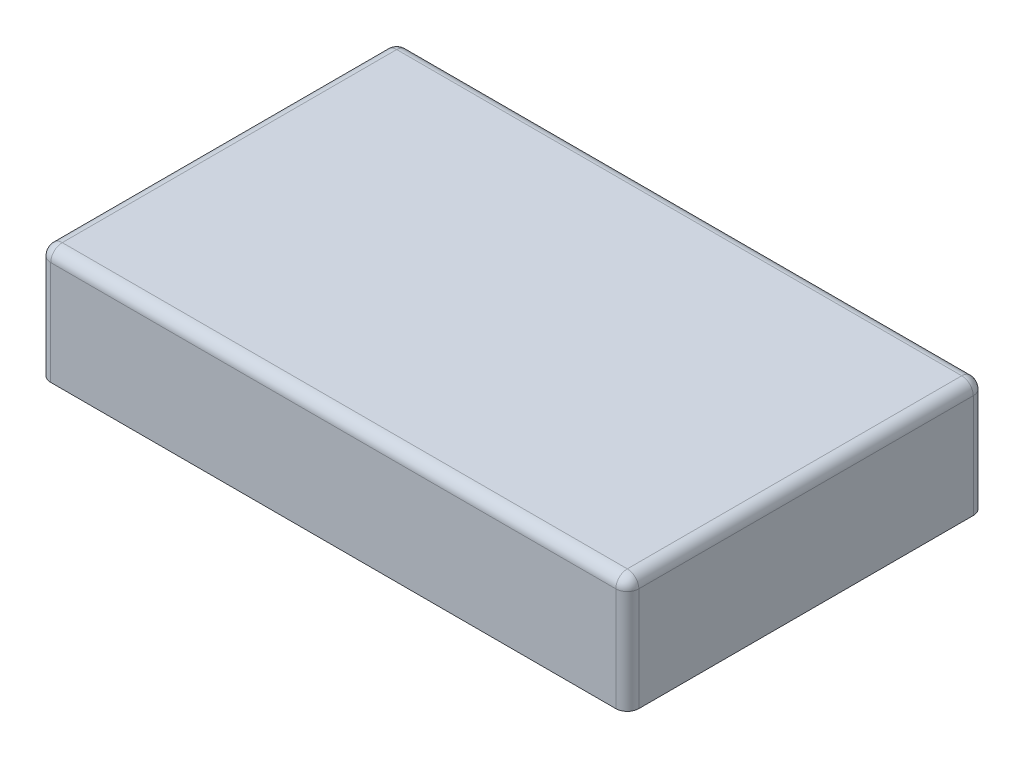
ISO-10303-21;
HEADER;
FILE_DESCRIPTION(('STEP AP214'),'2;1');
FILE_NAME('part.step','',(''),(''),'','','');
FILE_SCHEMA(('AUTOMOTIVE_DESIGN { 1 0 10303 214 1 1 1 1 }'));
ENDSEC;
DATA;
#1=APPLICATION_CONTEXT('core data for automotive mechanical design processes');
#2=APPLICATION_PROTOCOL_DEFINITION('international standard','automotive_design',2000,#1);
#3=PRODUCT_CONTEXT('',#1,'mechanical');
#4=PRODUCT('Part','Part','',(#3));
#5=PRODUCT_RELATED_PRODUCT_CATEGORY('part','',(#4));
#6=PRODUCT_DEFINITION_FORMATION('','',#4);
#7=PRODUCT_DEFINITION_CONTEXT('part definition',#1,'design');
#8=PRODUCT_DEFINITION('design','',#6,#7);
#9=PRODUCT_DEFINITION_SHAPE('','',#8);
#10=(LENGTH_UNIT() NAMED_UNIT(*) SI_UNIT(.MILLI.,.METRE.));
#11=(NAMED_UNIT(*) PLANE_ANGLE_UNIT() SI_UNIT($,.RADIAN.));
#12=(NAMED_UNIT(*) SI_UNIT($,.STERADIAN.) SOLID_ANGLE_UNIT());
#13=UNCERTAINTY_MEASURE_WITH_UNIT(LENGTH_MEASURE(1.E-05),#10,'distance_accuracy_value','');
#14=(GEOMETRIC_REPRESENTATION_CONTEXT(3) GLOBAL_UNCERTAINTY_ASSIGNED_CONTEXT((#13)) GLOBAL_UNIT_ASSIGNED_CONTEXT((#10,
#11,#12)) REPRESENTATION_CONTEXT('',''));
#15=CARTESIAN_POINT('',(0.,0.,0.));
#16=DIRECTION('',(0.,0.,1.));
#17=DIRECTION('',(1.,0.,0.));
#18=AXIS2_PLACEMENT_3D('',#15,#16,#17);
#19=CARTESIAN_POINT('',(49.,0.,29.));
#20=DIRECTION('',(0.,1.,0.));
#21=DIRECTION('',(0.,0.,1.));
#22=AXIS2_PLACEMENT_3D('',#19,#20,#21);
#23=PLANE('',#22);
#24=CARTESIAN_POINT('',(49.,0.,29.));
#25=DIRECTION('',(0.,1.,0.));
#26=DIRECTION('',(0.,0.,1.));
#27=AXIS2_PLACEMENT_3D('',#24,#25,#26);
#28=CIRCLE('',#27,2.);
#29=CARTESIAN_POINT('',(49.,0.,31.));
#30=VERTEX_POINT('',#29);
#31=CARTESIAN_POINT('',(51.,0.,29.));
#32=VERTEX_POINT('',#31);
#33=EDGE_CURVE('E211',#30,#32,#28,.T.);
#34=ORIENTED_EDGE('',*,*,#33,.F.);
#35=DIRECTION('',(1.,0.,0.));
#36=VECTOR('',#35,1.);
#37=CARTESIAN_POINT('',(-49.,0.,31.));
#38=LINE('',#37,#36);
#39=CARTESIAN_POINT('',(-49.,0.,31.));
#40=VERTEX_POINT('',#39);
#41=EDGE_CURVE('E239',#40,#30,#38,.T.);
#42=ORIENTED_EDGE('',*,*,#41,.F.);
#43=CARTESIAN_POINT('',(-49.,0.,29.));
#44=DIRECTION('',(0.,1.,0.));
#45=DIRECTION('',(0.,0.,-1.));
#46=AXIS2_PLACEMENT_3D('',#43,#44,#45);
#47=CIRCLE('',#46,2.);
#48=CARTESIAN_POINT('',(-51.,0.,29.));
#49=VERTEX_POINT('',#48);
#50=EDGE_CURVE('E236',#49,#40,#47,.T.);
#51=ORIENTED_EDGE('',*,*,#50,.F.);
#52=DIRECTION('',(0.,0.,1.));
#53=VECTOR('',#52,1.);
#54=CARTESIAN_POINT('',(-51.,0.,29.));
#55=LINE('',#54,#53);
#56=CARTESIAN_POINT('',(-51.,0.,-29.));
#57=VERTEX_POINT('',#56);
#58=EDGE_CURVE('E233',#57,#49,#55,.T.);
#59=ORIENTED_EDGE('',*,*,#58,.F.);
#60=CARTESIAN_POINT('',(-49.,0.,-29.));
#61=DIRECTION('',(0.,1.,0.));
#62=DIRECTION('',(0.,0.,-1.));
#63=AXIS2_PLACEMENT_3D('',#60,#61,#62);
#64=CIRCLE('',#63,2.);
#65=CARTESIAN_POINT('',(-49.,0.,-31.));
#66=VERTEX_POINT('',#65);
#67=EDGE_CURVE('E230',#66,#57,#64,.T.);
#68=ORIENTED_EDGE('',*,*,#67,.F.);
#69=DIRECTION('',(-1.,0.,0.));
#70=VECTOR('',#69,1.);
#71=CARTESIAN_POINT('',(-49.,0.,-31.));
#72=LINE('',#71,#70);
#73=CARTESIAN_POINT('',(49.,0.,-31.));
#74=VERTEX_POINT('',#73);
#75=EDGE_CURVE('E227',#74,#66,#72,.T.);
#76=ORIENTED_EDGE('',*,*,#75,.F.);
#77=CARTESIAN_POINT('',(49.,0.,-29.));
#78=DIRECTION('',(0.,1.,0.));
#79=DIRECTION('',(0.,0.,-1.));
#80=AXIS2_PLACEMENT_3D('',#77,#78,#79);
#81=CIRCLE('',#80,2.);
#82=CARTESIAN_POINT('',(51.,0.,-29.));
#83=VERTEX_POINT('',#82);
#84=EDGE_CURVE('E214',#83,#74,#81,.T.);
#85=ORIENTED_EDGE('',*,*,#84,.F.);
#86=DIRECTION('',(0.,0.,-1.));
#87=VECTOR('',#86,1.);
#88=CARTESIAN_POINT('',(51.,0.,29.));
#89=LINE('',#88,#87);
#90=EDGE_CURVE('E197',#32,#83,#89,.T.);
#91=ORIENTED_EDGE('',*,*,#90,.F.);
#92=EDGE_LOOP('',(#34,#42,#51,#59,#68,#76,#85,#91));
#93=FACE_BOUND('',#92,.T.);
#94=CARTESIAN_POINT('',(-48.,0.,-28.));
#95=DIRECTION('',(0.,1.,0.));
#96=DIRECTION('',(0.,0.,1.));
#97=AXIS2_PLACEMENT_3D('',#94,#95,#96);
#98=CIRCLE('',#97,2.);
#99=CARTESIAN_POINT('',(-50.,0.,-28.));
#100=VERTEX_POINT('',#99);
#101=CARTESIAN_POINT('',(-48.,0.,-30.));
#102=VERTEX_POINT('',#101);
#103=EDGE_CURVE('E313',#100,#102,#98,.F.);
#104=ORIENTED_EDGE('',*,*,#103,.F.);
#105=DIRECTION('',(0.,0.,1.));
#106=VECTOR('',#105,1.);
#107=CARTESIAN_POINT('',(-50.,0.,29.));
#108=LINE('',#107,#106);
#109=CARTESIAN_POINT('',(-50.,0.,28.));
#110=VERTEX_POINT('',#109);
#111=EDGE_CURVE('E311',#100,#110,#108,.T.);
#112=ORIENTED_EDGE('',*,*,#111,.T.);
#113=CARTESIAN_POINT('',(-48.,0.,28.));
#114=DIRECTION('',(0.,1.,0.));
#115=DIRECTION('',(0.,0.,1.));
#116=AXIS2_PLACEMENT_3D('',#113,#114,#115);
#117=CIRCLE('',#116,2.);
#118=CARTESIAN_POINT('',(-48.,0.,30.));
#119=VERTEX_POINT('',#118);
#120=EDGE_CURVE('E308',#119,#110,#117,.F.);
#121=ORIENTED_EDGE('',*,*,#120,.F.);
#122=DIRECTION('',(1.,0.,0.));
#123=VECTOR('',#122,1.);
#124=CARTESIAN_POINT('',(49.,0.,30.));
#125=LINE('',#124,#123);
#126=CARTESIAN_POINT('',(48.,0.,30.));
#127=VERTEX_POINT('',#126);
#128=EDGE_CURVE('E305',#119,#127,#125,.T.);
#129=ORIENTED_EDGE('',*,*,#128,.T.);
#130=CARTESIAN_POINT('',(48.,0.,28.));
#131=DIRECTION('',(0.,1.,0.));
#132=DIRECTION('',(0.,0.,1.));
#133=AXIS2_PLACEMENT_3D('',#130,#131,#132);
#134=CIRCLE('',#133,2.);
#135=CARTESIAN_POINT('',(50.,0.,28.));
#136=VERTEX_POINT('',#135);
#137=EDGE_CURVE('E302',#136,#127,#134,.F.);
#138=ORIENTED_EDGE('',*,*,#137,.F.);
#139=DIRECTION('',(0.,0.,-1.));
#140=VECTOR('',#139,1.);
#141=CARTESIAN_POINT('',(50.,0.,-29.));
#142=LINE('',#141,#140);
#143=CARTESIAN_POINT('',(50.,0.,-28.));
#144=VERTEX_POINT('',#143);
#145=EDGE_CURVE('E298',#136,#144,#142,.T.);
#146=ORIENTED_EDGE('',*,*,#145,.T.);
#147=CARTESIAN_POINT('',(48.,0.,-28.));
#148=DIRECTION('',(0.,1.,0.));
#149=DIRECTION('',(0.,0.,1.));
#150=AXIS2_PLACEMENT_3D('',#147,#148,#149);
#151=CIRCLE('',#150,2.);
#152=CARTESIAN_POINT('',(48.,0.,-30.));
#153=VERTEX_POINT('',#152);
#154=EDGE_CURVE('E277',#153,#144,#151,.F.);
#155=ORIENTED_EDGE('',*,*,#154,.F.);
#156=DIRECTION('',(-1.,0.,0.));
#157=VECTOR('',#156,1.);
#158=CARTESIAN_POINT('',(-49.,0.,-30.));
#159=LINE('',#158,#157);
#160=EDGE_CURVE('E300',#153,#102,#159,.T.);
#161=ORIENTED_EDGE('',*,*,#160,.T.);
#162=EDGE_LOOP('',(#104,#112,#121,#129,#138,#146,#155,#161));
#163=FACE_BOUND('',#162,.T.);
#164=ADVANCED_FACE('F33',(#93,#163),#23,.F.);
#165=CARTESIAN_POINT('',(49.,20.,29.));
#166=DIRECTION('',(0.,-1.,0.));
#167=DIRECTION('',(0.,0.,-1.));
#168=AXIS2_PLACEMENT_3D('',#165,#166,#167);
#169=CYLINDRICAL_SURFACE('',#168,2.);
#170=DIRECTION('',(0.,-1.,0.));
#171=VECTOR('',#170,1.);
#172=CARTESIAN_POINT('',(51.,20.,29.));
#173=LINE('',#172,#171);
#174=CARTESIAN_POINT('',(51.,18.,29.));
#175=VERTEX_POINT('',#174);
#176=EDGE_CURVE('E193',#175,#32,#173,.T.);
#177=ORIENTED_EDGE('',*,*,#176,.F.);
#178=CARTESIAN_POINT('',(49.,18.,29.));
#179=DIRECTION('',(0.,-1.,0.));
#180=DIRECTION('',(0.,0.,-1.));
#181=AXIS2_PLACEMENT_3D('',#178,#179,#180);
#182=CIRCLE('',#181,2.);
#183=CARTESIAN_POINT('',(49.,18.,31.));
#184=VERTEX_POINT('',#183);
#185=EDGE_CURVE('E275',#175,#184,#182,.T.);
#186=ORIENTED_EDGE('',*,*,#185,.T.);
#187=DIRECTION('',(0.,-1.,0.));
#188=VECTOR('',#187,1.);
#189=CARTESIAN_POINT('',(49.,20.,31.));
#190=LINE('',#189,#188);
#191=EDGE_CURVE('E218',#184,#30,#190,.T.);
#192=ORIENTED_EDGE('',*,*,#191,.T.);
#193=ORIENTED_EDGE('',*,*,#33,.T.);
#194=EDGE_LOOP('',(#177,#186,#192,#193));
#195=FACE_BOUND('',#194,.T.);
#196=ADVANCED_FACE('F216',(#195),#169,.T.);
#197=CARTESIAN_POINT('',(51.,20.,29.));
#198=DIRECTION('',(-1.,0.,0.));
#199=DIRECTION('',(0.,0.,1.));
#200=AXIS2_PLACEMENT_3D('',#197,#198,#199);
#201=PLANE('',#200);
#202=DIRECTION('',(0.,-1.,0.));
#203=VECTOR('',#202,1.);
#204=CARTESIAN_POINT('',(51.,20.,-29.));
#205=LINE('',#204,#203);
#206=CARTESIAN_POINT('',(51.,18.,-29.));
#207=VERTEX_POINT('',#206);
#208=EDGE_CURVE('E205',#207,#83,#205,.T.);
#209=ORIENTED_EDGE('',*,*,#208,.F.);
#210=DIRECTION('',(0.,0.,-1.));
#211=VECTOR('',#210,1.);
#212=CARTESIAN_POINT('',(51.,18.,29.));
#213=LINE('',#212,#211);
#214=EDGE_CURVE('E200',#207,#175,#213,.F.);
#215=ORIENTED_EDGE('',*,*,#214,.T.);
#216=ORIENTED_EDGE('',*,*,#176,.T.);
#217=ORIENTED_EDGE('',*,*,#90,.T.);
#218=EDGE_LOOP('',(#209,#215,#216,#217));
#219=FACE_BOUND('',#218,.T.);
#220=ADVANCED_FACE('F196',(#219),#201,.F.);
#221=CARTESIAN_POINT('',(49.,20.,-29.));
#222=DIRECTION('',(0.,-1.,0.));
#223=DIRECTION('',(0.,0.,-1.));
#224=AXIS2_PLACEMENT_3D('',#221,#222,#223);
#225=CYLINDRICAL_SURFACE('',#224,2.);
#226=DIRECTION('',(0.,-1.,0.));
#227=VECTOR('',#226,1.);
#228=CARTESIAN_POINT('',(49.,20.,-31.));
#229=LINE('',#228,#227);
#230=CARTESIAN_POINT('',(49.,18.,-31.));
#231=VERTEX_POINT('',#230);
#232=EDGE_CURVE('E250',#231,#74,#229,.T.);
#233=ORIENTED_EDGE('',*,*,#232,.F.);
#234=CARTESIAN_POINT('',(49.,18.,-29.));
#235=DIRECTION('',(0.,-1.,0.));
#236=DIRECTION('',(0.,0.,-1.));
#237=AXIS2_PLACEMENT_3D('',#234,#235,#236);
#238=CIRCLE('',#237,2.);
#239=EDGE_CURVE('E272',#231,#207,#238,.T.);
#240=ORIENTED_EDGE('',*,*,#239,.T.);
#241=ORIENTED_EDGE('',*,*,#208,.T.);
#242=ORIENTED_EDGE('',*,*,#84,.T.);
#243=EDGE_LOOP('',(#233,#240,#241,#242));
#244=FACE_BOUND('',#243,.T.);
#245=ADVANCED_FACE('F544',(#244),#225,.T.);
#246=CARTESIAN_POINT('',(-49.,20.,-31.));
#247=DIRECTION('',(0.,0.,1.));
#248=DIRECTION('',(1.,0.,0.));
#249=AXIS2_PLACEMENT_3D('',#246,#247,#248);
#250=PLANE('',#249);
#251=DIRECTION('',(0.,-1.,0.));
#252=VECTOR('',#251,1.);
#253=CARTESIAN_POINT('',(-49.,20.,-31.));
#254=LINE('',#253,#252);
#255=CARTESIAN_POINT('',(-49.,18.,-31.));
#256=VERTEX_POINT('',#255);
#257=EDGE_CURVE('E248',#256,#66,#254,.T.);
#258=ORIENTED_EDGE('',*,*,#257,.F.);
#259=DIRECTION('',(-1.,0.,0.));
#260=VECTOR('',#259,1.);
#261=CARTESIAN_POINT('',(49.,18.,-31.));
#262=LINE('',#261,#260);
#263=EDGE_CURVE('E270',#256,#231,#262,.F.);
#264=ORIENTED_EDGE('',*,*,#263,.T.);
#265=ORIENTED_EDGE('',*,*,#232,.T.);
#266=ORIENTED_EDGE('',*,*,#75,.T.);
#267=EDGE_LOOP('',(#258,#264,#265,#266));
#268=FACE_BOUND('',#267,.T.);
#269=ADVANCED_FACE('F540',(#268),#250,.F.);
#270=CARTESIAN_POINT('',(-49.,20.,-29.));
#271=DIRECTION('',(0.,-1.,0.));
#272=DIRECTION('',(0.,0.,-1.));
#273=AXIS2_PLACEMENT_3D('',#270,#271,#272);
#274=CYLINDRICAL_SURFACE('',#273,2.);
#275=DIRECTION('',(0.,-1.,0.));
#276=VECTOR('',#275,1.);
#277=CARTESIAN_POINT('',(-51.,20.,-29.));
#278=LINE('',#277,#276);
#279=CARTESIAN_POINT('',(-51.,18.,-29.));
#280=VERTEX_POINT('',#279);
#281=EDGE_CURVE('E246',#280,#57,#278,.T.);
#282=ORIENTED_EDGE('',*,*,#281,.F.);
#283=CARTESIAN_POINT('',(-49.,18.,-29.));
#284=DIRECTION('',(0.,-1.,0.));
#285=DIRECTION('',(0.,0.,-1.));
#286=AXIS2_PLACEMENT_3D('',#283,#284,#285);
#287=CIRCLE('',#286,2.);
#288=EDGE_CURVE('E268',#280,#256,#287,.T.);
#289=ORIENTED_EDGE('',*,*,#288,.T.);
#290=ORIENTED_EDGE('',*,*,#257,.T.);
#291=ORIENTED_EDGE('',*,*,#67,.T.);
#292=EDGE_LOOP('',(#282,#289,#290,#291));
#293=FACE_BOUND('',#292,.T.);
#294=ADVANCED_FACE('F536',(#293),#274,.T.);
#295=CARTESIAN_POINT('',(-51.,20.,29.));
#296=DIRECTION('',(1.,0.,0.));
#297=DIRECTION('',(0.,0.,-1.));
#298=AXIS2_PLACEMENT_3D('',#295,#296,#297);
#299=PLANE('',#298);
#300=DIRECTION('',(0.,-1.,0.));
#301=VECTOR('',#300,1.);
#302=CARTESIAN_POINT('',(-51.,20.,29.));
#303=LINE('',#302,#301);
#304=CARTESIAN_POINT('',(-51.,18.,29.));
#305=VERTEX_POINT('',#304);
#306=EDGE_CURVE('E244',#305,#49,#303,.T.);
#307=ORIENTED_EDGE('',*,*,#306,.F.);
#308=DIRECTION('',(0.,0.,1.));
#309=VECTOR('',#308,1.);
#310=CARTESIAN_POINT('',(-51.,18.,-29.));
#311=LINE('',#310,#309);
#312=EDGE_CURVE('E266',#305,#280,#311,.F.);
#313=ORIENTED_EDGE('',*,*,#312,.T.);
#314=ORIENTED_EDGE('',*,*,#281,.T.);
#315=ORIENTED_EDGE('',*,*,#58,.T.);
#316=EDGE_LOOP('',(#307,#313,#314,#315));
#317=FACE_BOUND('',#316,.T.);
#318=ADVANCED_FACE('F532',(#317),#299,.F.);
#319=CARTESIAN_POINT('',(-49.,20.,29.));
#320=DIRECTION('',(0.,-1.,0.));
#321=DIRECTION('',(0.,0.,-1.));
#322=AXIS2_PLACEMENT_3D('',#319,#320,#321);
#323=CYLINDRICAL_SURFACE('',#322,2.);
#324=DIRECTION('',(0.,-1.,0.));
#325=VECTOR('',#324,1.);
#326=CARTESIAN_POINT('',(-49.,20.,31.));
#327=LINE('',#326,#325);
#328=CARTESIAN_POINT('',(-49.,18.,31.));
#329=VERTEX_POINT('',#328);
#330=EDGE_CURVE('E242',#329,#40,#327,.T.);
#331=ORIENTED_EDGE('',*,*,#330,.F.);
#332=CARTESIAN_POINT('',(-49.,18.,29.));
#333=DIRECTION('',(0.,-1.,0.));
#334=DIRECTION('',(0.,0.,-1.));
#335=AXIS2_PLACEMENT_3D('',#332,#333,#334);
#336=CIRCLE('',#335,2.);
#337=EDGE_CURVE('E264',#329,#305,#336,.T.);
#338=ORIENTED_EDGE('',*,*,#337,.T.);
#339=ORIENTED_EDGE('',*,*,#306,.T.);
#340=ORIENTED_EDGE('',*,*,#50,.T.);
#341=EDGE_LOOP('',(#331,#338,#339,#340));
#342=FACE_BOUND('',#341,.T.);
#343=ADVANCED_FACE('F528',(#342),#323,.T.);
#344=CARTESIAN_POINT('',(-49.,20.,31.));
#345=DIRECTION('',(0.,0.,-1.));
#346=DIRECTION('',(-1.,0.,0.));
#347=AXIS2_PLACEMENT_3D('',#344,#345,#346);
#348=PLANE('',#347);
#349=ORIENTED_EDGE('',*,*,#191,.F.);
#350=DIRECTION('',(1.,0.,0.));
#351=VECTOR('',#350,1.);
#352=CARTESIAN_POINT('',(-49.,18.,31.));
#353=LINE('',#352,#351);
#354=EDGE_CURVE('E261',#184,#329,#353,.F.);
#355=ORIENTED_EDGE('',*,*,#354,.T.);
#356=ORIENTED_EDGE('',*,*,#330,.T.);
#357=ORIENTED_EDGE('',*,*,#41,.T.);
#358=EDGE_LOOP('',(#349,#355,#356,#357));
#359=FACE_BOUND('',#358,.T.);
#360=ADVANCED_FACE('F525',(#359),#348,.F.);
#361=CARTESIAN_POINT('',(49.,20.,29.));
#362=DIRECTION('',(0.,1.,0.));
#363=DIRECTION('',(0.,0.,1.));
#364=AXIS2_PLACEMENT_3D('',#361,#362,#363);
#365=PLANE('',#364);
#366=DIRECTION('',(0.,0.,1.));
#367=VECTOR('',#366,1.);
#368=CARTESIAN_POINT('',(-49.,20.,29.));
#369=LINE('',#368,#367);
#370=CARTESIAN_POINT('',(-49.,20.,-29.));
#371=VERTEX_POINT('',#370);
#372=CARTESIAN_POINT('',(-49.,20.,29.));
#373=VERTEX_POINT('',#372);
#374=EDGE_CURVE('E256',#371,#373,#369,.T.);
#375=ORIENTED_EDGE('',*,*,#374,.T.);
#376=DIRECTION('',(1.,0.,0.));
#377=VECTOR('',#376,1.);
#378=CARTESIAN_POINT('',(49.,20.,29.));
#379=LINE('',#378,#377);
#380=CARTESIAN_POINT('',(49.,20.,29.));
#381=VERTEX_POINT('',#380);
#382=EDGE_CURVE('E258',#373,#381,#379,.T.);
#383=ORIENTED_EDGE('',*,*,#382,.T.);
#384=DIRECTION('',(0.,0.,-1.));
#385=VECTOR('',#384,1.);
#386=CARTESIAN_POINT('',(49.,20.,-29.));
#387=LINE('',#386,#385);
#388=CARTESIAN_POINT('',(49.,20.,-29.));
#389=VERTEX_POINT('',#388);
#390=EDGE_CURVE('E204',#381,#389,#387,.T.);
#391=ORIENTED_EDGE('',*,*,#390,.T.);
#392=DIRECTION('',(-1.,0.,0.));
#393=VECTOR('',#392,1.);
#394=CARTESIAN_POINT('',(-49.,20.,-29.));
#395=LINE('',#394,#393);
#396=EDGE_CURVE('E254',#389,#371,#395,.T.);
#397=ORIENTED_EDGE('',*,*,#396,.T.);
#398=EDGE_LOOP('',(#375,#383,#391,#397));
#399=FACE_BOUND('',#398,.T.);
#400=ADVANCED_FACE('F524',(#399),#365,.T.);
#401=CARTESIAN_POINT('',(49.,18.,-29.));
#402=DIRECTION('',(1.,0.,0.));
#403=DIRECTION('',(0.,0.,-1.));
#404=AXIS2_PLACEMENT_3D('',#401,#402,#403);
#405=CYLINDRICAL_SURFACE('',#404,2.);
#406=CARTESIAN_POINT('',(49.,18.,-29.));
#407=DIRECTION('',(1.,0.,0.));
#408=DIRECTION('',(0.,0.,-1.));
#409=AXIS2_PLACEMENT_3D('',#406,#407,#408);
#410=CIRCLE('',#409,2.);
#411=EDGE_CURVE('E223',#231,#389,#410,.T.);
#412=ORIENTED_EDGE('',*,*,#411,.F.);
#413=ORIENTED_EDGE('',*,*,#263,.F.);
#414=CARTESIAN_POINT('',(-49.,18.,-29.));
#415=DIRECTION('',(-1.,0.,0.));
#416=DIRECTION('',(0.,0.,1.));
#417=AXIS2_PLACEMENT_3D('',#414,#415,#416);
#418=CIRCLE('',#417,2.);
#419=EDGE_CURVE('E220',#371,#256,#418,.T.);
#420=ORIENTED_EDGE('',*,*,#419,.F.);
#421=ORIENTED_EDGE('',*,*,#396,.F.);
#422=EDGE_LOOP('',(#412,#413,#420,#421));
#423=FACE_BOUND('',#422,.T.);
#424=ADVANCED_FACE('F579',(#423),#405,.T.);
#425=CARTESIAN_POINT('',(-49.,18.,-29.));
#426=DIRECTION('',(0.,1.,0.));
#427=DIRECTION('',(0.,0.,1.));
#428=AXIS2_PLACEMENT_3D('',#425,#426,#427);
#429=SPHERICAL_SURFACE('',#428,2.);
#430=ORIENTED_EDGE('',*,*,#419,.T.);
#431=ORIENTED_EDGE('',*,*,#288,.F.);
#432=CARTESIAN_POINT('',(-49.,18.,-29.));
#433=DIRECTION('',(0.,0.,1.));
#434=DIRECTION('',(1.,0.,0.));
#435=AXIS2_PLACEMENT_3D('',#432,#433,#434);
#436=CIRCLE('',#435,2.);
#437=EDGE_CURVE('E291',#371,#280,#436,.T.);
#438=ORIENTED_EDGE('',*,*,#437,.F.);
#439=EDGE_LOOP('',(#430,#431,#438));
#440=FACE_BOUND('',#439,.T.);
#441=ADVANCED_FACE('F575',(#440),#429,.T.);
#442=CARTESIAN_POINT('',(49.,18.,-29.));
#443=DIRECTION('',(0.,1.,0.));
#444=DIRECTION('',(0.,0.,1.));
#445=AXIS2_PLACEMENT_3D('',#442,#443,#444);
#446=SPHERICAL_SURFACE('',#445,2.);
#447=ORIENTED_EDGE('',*,*,#239,.F.);
#448=ORIENTED_EDGE('',*,*,#411,.T.);
#449=CARTESIAN_POINT('',(49.,18.,-29.));
#450=DIRECTION('',(0.,0.,1.));
#451=DIRECTION('',(1.,0.,0.));
#452=AXIS2_PLACEMENT_3D('',#449,#450,#451);
#453=CIRCLE('',#452,2.);
#454=EDGE_CURVE('E288',#207,#389,#453,.T.);
#455=ORIENTED_EDGE('',*,*,#454,.F.);
#456=EDGE_LOOP('',(#447,#448,#455));
#457=FACE_BOUND('',#456,.T.);
#458=ADVANCED_FACE('F571',(#457),#446,.T.);
#459=CARTESIAN_POINT('',(-49.,18.,29.));
#460=DIRECTION('',(0.,0.,-1.));
#461=DIRECTION('',(-1.,0.,0.));
#462=AXIS2_PLACEMENT_3D('',#459,#460,#461);
#463=CYLINDRICAL_SURFACE('',#462,2.);
#464=ORIENTED_EDGE('',*,*,#437,.T.);
#465=ORIENTED_EDGE('',*,*,#312,.F.);
#466=CARTESIAN_POINT('',(-49.,18.,29.));
#467=DIRECTION('',(0.,0.,1.));
#468=DIRECTION('',(1.,0.,0.));
#469=AXIS2_PLACEMENT_3D('',#466,#467,#468);
#470=CIRCLE('',#469,2.);
#471=EDGE_CURVE('E285',#373,#305,#470,.T.);
#472=ORIENTED_EDGE('',*,*,#471,.F.);
#473=ORIENTED_EDGE('',*,*,#374,.F.);
#474=EDGE_LOOP('',(#464,#465,#472,#473));
#475=FACE_BOUND('',#474,.T.);
#476=ADVANCED_FACE('F567',(#475),#463,.T.);
#477=CARTESIAN_POINT('',(49.,18.,29.));
#478=DIRECTION('',(0.,0.,1.));
#479=DIRECTION('',(1.,0.,0.));
#480=AXIS2_PLACEMENT_3D('',#477,#478,#479);
#481=CYLINDRICAL_SURFACE('',#480,2.);
#482=ORIENTED_EDGE('',*,*,#454,.T.);
#483=ORIENTED_EDGE('',*,*,#390,.F.);
#484=CARTESIAN_POINT('',(49.,18.,29.));
#485=DIRECTION('',(0.,0.,1.));
#486=DIRECTION('',(1.,0.,0.));
#487=AXIS2_PLACEMENT_3D('',#484,#485,#486);
#488=CIRCLE('',#487,2.);
#489=EDGE_CURVE('E282',#175,#381,#488,.T.);
#490=ORIENTED_EDGE('',*,*,#489,.F.);
#491=ORIENTED_EDGE('',*,*,#214,.F.);
#492=EDGE_LOOP('',(#482,#483,#490,#491));
#493=FACE_BOUND('',#492,.T.);
#494=ADVANCED_FACE('F563',(#493),#481,.T.);
#495=CARTESIAN_POINT('',(-49.,18.,29.));
#496=DIRECTION('',(0.,1.,0.));
#497=DIRECTION('',(0.,0.,1.));
#498=AXIS2_PLACEMENT_3D('',#495,#496,#497);
#499=SPHERICAL_SURFACE('',#498,2.);
#500=ORIENTED_EDGE('',*,*,#471,.T.);
#501=ORIENTED_EDGE('',*,*,#337,.F.);
#502=CARTESIAN_POINT('',(-49.,18.,29.));
#503=DIRECTION('',(1.,0.,0.));
#504=DIRECTION('',(0.,0.,-1.));
#505=AXIS2_PLACEMENT_3D('',#502,#503,#504);
#506=CIRCLE('',#505,2.);
#507=EDGE_CURVE('E280',#373,#329,#506,.T.);
#508=ORIENTED_EDGE('',*,*,#507,.F.);
#509=EDGE_LOOP('',(#500,#501,#508));
#510=FACE_BOUND('',#509,.T.);
#511=ADVANCED_FACE('F559',(#510),#499,.T.);
#512=CARTESIAN_POINT('',(49.,18.,29.));
#513=DIRECTION('',(0.,1.,0.));
#514=DIRECTION('',(0.,0.,1.));
#515=AXIS2_PLACEMENT_3D('',#512,#513,#514);
#516=SPHERICAL_SURFACE('',#515,2.);
#517=ORIENTED_EDGE('',*,*,#185,.F.);
#518=ORIENTED_EDGE('',*,*,#489,.T.);
#519=CARTESIAN_POINT('',(49.,18.,29.));
#520=DIRECTION('',(-1.,0.,0.));
#521=DIRECTION('',(0.,0.,1.));
#522=AXIS2_PLACEMENT_3D('',#519,#520,#521);
#523=CIRCLE('',#522,2.);
#524=EDGE_CURVE('E278',#184,#381,#523,.T.);
#525=ORIENTED_EDGE('',*,*,#524,.F.);
#526=EDGE_LOOP('',(#517,#518,#525));
#527=FACE_BOUND('',#526,.T.);
#528=ADVANCED_FACE('F555',(#527),#516,.T.);
#529=CARTESIAN_POINT('',(49.,18.,29.));
#530=DIRECTION('',(-1.,0.,0.));
#531=DIRECTION('',(0.,0.,1.));
#532=AXIS2_PLACEMENT_3D('',#529,#530,#531);
#533=CYLINDRICAL_SURFACE('',#532,2.);
#534=ORIENTED_EDGE('',*,*,#507,.T.);
#535=ORIENTED_EDGE('',*,*,#354,.F.);
#536=ORIENTED_EDGE('',*,*,#524,.T.);
#537=ORIENTED_EDGE('',*,*,#382,.F.);
#538=EDGE_LOOP('',(#534,#535,#536,#537));
#539=FACE_BOUND('',#538,.T.);
#540=ADVANCED_FACE('F551',(#539),#533,.T.);
#541=CARTESIAN_POINT('',(49.,20.,29.));
#542=DIRECTION('',(-1.,0.,0.));
#543=DIRECTION('',(0.,0.,1.));
#544=AXIS2_PLACEMENT_3D('',#541,#542,#543);
#545=PLANE('',#544);
#546=DIRECTION('',(0.,-1.,0.));
#547=VECTOR('',#546,1.);
#548=CARTESIAN_POINT('',(49.,18.,28.));
#549=LINE('',#548,#547);
#550=CARTESIAN_POINT('',(49.,1.,28.));
#551=VERTEX_POINT('',#550);
#552=CARTESIAN_POINT('',(49.,17.,28.));
#553=VERTEX_POINT('',#552);
#554=EDGE_CURVE('E42',#551,#553,#549,.F.);
#555=ORIENTED_EDGE('',*,*,#554,.T.);
#556=DIRECTION('',(0.,0.,-1.));
#557=VECTOR('',#556,1.);
#558=CARTESIAN_POINT('',(49.,17.,29.));
#559=LINE('',#558,#557);
#560=CARTESIAN_POINT('',(49.,17.,-28.));
#561=VERTEX_POINT('',#560);
#562=EDGE_CURVE('E11',#553,#561,#559,.T.);
#563=ORIENTED_EDGE('',*,*,#562,.T.);
#564=DIRECTION('',(0.,-1.,0.));
#565=VECTOR('',#564,1.);
#566=CARTESIAN_POINT('',(49.,0.,-28.));
#567=LINE('',#566,#565);
#568=CARTESIAN_POINT('',(49.,1.,-28.));
#569=VERTEX_POINT('',#568);
#570=EDGE_CURVE('E352',#561,#569,#567,.T.);
#571=ORIENTED_EDGE('',*,*,#570,.T.);
#572=DIRECTION('',(0.,0.,-1.));
#573=VECTOR('',#572,1.);
#574=CARTESIAN_POINT('',(49.,1.,29.));
#575=LINE('',#574,#573);
#576=EDGE_CURVE('E53',#569,#551,#575,.F.);
#577=ORIENTED_EDGE('',*,*,#576,.T.);
#578=EDGE_LOOP('',(#555,#563,#571,#577));
#579=FACE_BOUND('',#578,.T.);
#580=ADVANCED_FACE('F554',(#579),#545,.T.);
#581=CARTESIAN_POINT('',(-49.,20.,-29.));
#582=DIRECTION('',(0.,0.,1.));
#583=DIRECTION('',(1.,0.,0.));
#584=AXIS2_PLACEMENT_3D('',#581,#582,#583);
#585=PLANE('',#584);
#586=DIRECTION('',(1.,0.,0.));
#587=VECTOR('',#586,1.);
#588=CARTESIAN_POINT('',(-49.,17.,-29.));
#589=LINE('',#588,#587);
#590=CARTESIAN_POINT('',(48.,17.,-29.));
#591=VERTEX_POINT('',#590);
#592=CARTESIAN_POINT('',(-48.,17.,-29.));
#593=VERTEX_POINT('',#592);
#594=EDGE_CURVE('E327',#591,#593,#589,.F.);
#595=ORIENTED_EDGE('',*,*,#594,.T.);
#596=DIRECTION('',(0.,-1.,0.));
#597=VECTOR('',#596,1.);
#598=CARTESIAN_POINT('',(-48.,0.,-29.));
#599=LINE('',#598,#597);
#600=CARTESIAN_POINT('',(-48.,1.,-29.));
#601=VERTEX_POINT('',#600);
#602=EDGE_CURVE('E332',#593,#601,#599,.T.);
#603=ORIENTED_EDGE('',*,*,#602,.T.);
#604=DIRECTION('',(-1.,0.,0.));
#605=VECTOR('',#604,1.);
#606=CARTESIAN_POINT('',(49.,1.,-29.));
#607=LINE('',#606,#605);
#608=CARTESIAN_POINT('',(48.,1.,-29.));
#609=VERTEX_POINT('',#608);
#610=EDGE_CURVE('E329',#601,#609,#607,.F.);
#611=ORIENTED_EDGE('',*,*,#610,.T.);
#612=DIRECTION('',(0.,-1.,0.));
#613=VECTOR('',#612,1.);
#614=CARTESIAN_POINT('',(48.,18.,-29.));
#615=LINE('',#614,#613);
#616=EDGE_CURVE('E325',#609,#591,#615,.F.);
#617=ORIENTED_EDGE('',*,*,#616,.T.);
#618=EDGE_LOOP('',(#595,#603,#611,#617));
#619=FACE_BOUND('',#618,.T.);
#620=ADVANCED_FACE('F447',(#619),#585,.T.);
#621=CARTESIAN_POINT('',(-49.,20.,29.));
#622=DIRECTION('',(1.,0.,0.));
#623=DIRECTION('',(0.,0.,-1.));
#624=AXIS2_PLACEMENT_3D('',#621,#622,#623);
#625=PLANE('',#624);
#626=DIRECTION('',(0.,-1.,0.));
#627=VECTOR('',#626,1.);
#628=CARTESIAN_POINT('',(-49.,18.,-28.));
#629=LINE('',#628,#627);
#630=CARTESIAN_POINT('',(-49.,1.,-28.));
#631=VERTEX_POINT('',#630);
#632=CARTESIAN_POINT('',(-49.,17.,-28.));
#633=VERTEX_POINT('',#632);
#634=EDGE_CURVE('E347',#631,#633,#629,.F.);
#635=ORIENTED_EDGE('',*,*,#634,.T.);
#636=DIRECTION('',(0.,0.,-1.));
#637=VECTOR('',#636,1.);
#638=CARTESIAN_POINT('',(-49.,17.,29.));
#639=LINE('',#638,#637);
#640=CARTESIAN_POINT('',(-49.,17.,28.));
#641=VERTEX_POINT('',#640);
#642=EDGE_CURVE('E349',#633,#641,#639,.F.);
#643=ORIENTED_EDGE('',*,*,#642,.T.);
#644=DIRECTION('',(0.,-1.,0.));
#645=VECTOR('',#644,1.);
#646=CARTESIAN_POINT('',(-49.,0.,28.));
#647=LINE('',#646,#645);
#648=CARTESIAN_POINT('',(-49.,1.,28.));
#649=VERTEX_POINT('',#648);
#650=EDGE_CURVE('E343',#641,#649,#647,.T.);
#651=ORIENTED_EDGE('',*,*,#650,.T.);
#652=DIRECTION('',(0.,0.,1.));
#653=VECTOR('',#652,1.);
#654=CARTESIAN_POINT('',(-49.,1.,-29.));
#655=LINE('',#654,#653);
#656=EDGE_CURVE('E345',#649,#631,#655,.F.);
#657=ORIENTED_EDGE('',*,*,#656,.T.);
#658=EDGE_LOOP('',(#635,#643,#651,#657));
#659=FACE_BOUND('',#658,.T.);
#660=ADVANCED_FACE('F439',(#659),#625,.T.);
#661=CARTESIAN_POINT('',(-49.,20.,29.));
#662=DIRECTION('',(0.,0.,-1.));
#663=DIRECTION('',(-1.,0.,0.));
#664=AXIS2_PLACEMENT_3D('',#661,#662,#663);
#665=PLANE('',#664);
#666=DIRECTION('',(1.,0.,0.));
#667=VECTOR('',#666,1.);
#668=CARTESIAN_POINT('',(-49.,1.,29.));
#669=LINE('',#668,#667);
#670=CARTESIAN_POINT('',(48.,1.,29.));
#671=VERTEX_POINT('',#670);
#672=CARTESIAN_POINT('',(-48.,1.,29.));
#673=VERTEX_POINT('',#672);
#674=EDGE_CURVE('E320',#671,#673,#669,.F.);
#675=ORIENTED_EDGE('',*,*,#674,.T.);
#676=DIRECTION('',(0.,-1.,0.));
#677=VECTOR('',#676,1.);
#678=CARTESIAN_POINT('',(-48.,18.,29.));
#679=LINE('',#678,#677);
#680=CARTESIAN_POINT('',(-48.,17.,29.));
#681=VERTEX_POINT('',#680);
#682=EDGE_CURVE('E323',#673,#681,#679,.F.);
#683=ORIENTED_EDGE('',*,*,#682,.T.);
#684=DIRECTION('',(-1.,0.,0.));
#685=VECTOR('',#684,1.);
#686=CARTESIAN_POINT('',(-49.,17.,29.));
#687=LINE('',#686,#685);
#688=CARTESIAN_POINT('',(48.,17.,29.));
#689=VERTEX_POINT('',#688);
#690=EDGE_CURVE('E318',#681,#689,#687,.F.);
#691=ORIENTED_EDGE('',*,*,#690,.T.);
#692=DIRECTION('',(0.,-1.,0.));
#693=VECTOR('',#692,1.);
#694=CARTESIAN_POINT('',(48.,0.,29.));
#695=LINE('',#694,#693);
#696=EDGE_CURVE('E316',#689,#671,#695,.T.);
#697=ORIENTED_EDGE('',*,*,#696,.T.);
#698=EDGE_LOOP('',(#675,#683,#691,#697));
#699=FACE_BOUND('',#698,.T.);
#700=ADVANCED_FACE('F507',(#699),#665,.T.);
#701=CARTESIAN_POINT('',(49.,18.,29.));
#702=DIRECTION('',(0.,1.,0.));
#703=DIRECTION('',(0.,0.,1.));
#704=AXIS2_PLACEMENT_3D('',#701,#702,#703);
#705=PLANE('',#704);
#706=DIRECTION('',(-1.,0.,0.));
#707=VECTOR('',#706,1.);
#708=CARTESIAN_POINT('',(49.,18.,28.));
#709=LINE('',#708,#707);
#710=CARTESIAN_POINT('',(48.,18.,28.));
#711=VERTEX_POINT('',#710);
#712=CARTESIAN_POINT('',(-48.,18.,28.));
#713=VERTEX_POINT('',#712);
#714=EDGE_CURVE('E338',#711,#713,#709,.T.);
#715=ORIENTED_EDGE('',*,*,#714,.T.);
#716=DIRECTION('',(0.,0.,-1.));
#717=VECTOR('',#716,1.);
#718=CARTESIAN_POINT('',(-48.,18.,29.));
#719=LINE('',#718,#717);
#720=CARTESIAN_POINT('',(-48.,18.,-28.));
#721=VERTEX_POINT('',#720);
#722=EDGE_CURVE('E341',#713,#721,#719,.T.);
#723=ORIENTED_EDGE('',*,*,#722,.T.);
#724=DIRECTION('',(1.,0.,0.));
#725=VECTOR('',#724,1.);
#726=CARTESIAN_POINT('',(49.,18.,-28.));
#727=LINE('',#726,#725);
#728=CARTESIAN_POINT('',(48.,18.,-28.));
#729=VERTEX_POINT('',#728);
#730=EDGE_CURVE('E336',#721,#729,#727,.T.);
#731=ORIENTED_EDGE('',*,*,#730,.T.);
#732=DIRECTION('',(0.,0.,-1.));
#733=VECTOR('',#732,1.);
#734=CARTESIAN_POINT('',(48.,18.,29.));
#735=LINE('',#734,#733);
#736=EDGE_CURVE('E334',#729,#711,#735,.F.);
#737=ORIENTED_EDGE('',*,*,#736,.T.);
#738=EDGE_LOOP('',(#715,#723,#731,#737));
#739=FACE_BOUND('',#738,.T.);
#740=ADVANCED_FACE('F466',(#739),#705,.F.);
#741=CARTESIAN_POINT('',(49.,17.,-28.));
#742=DIRECTION('',(1.,0.,0.));
#743=DIRECTION('',(0.,0.,-1.));
#744=AXIS2_PLACEMENT_3D('',#741,#742,#743);
#745=CYLINDRICAL_SURFACE('',#744,1.);
#746=CARTESIAN_POINT('',(-48.,17.,-28.));
#747=DIRECTION('',(1.,0.,0.));
#748=DIRECTION('',(0.,0.,-1.));
#749=AXIS2_PLACEMENT_3D('',#746,#747,#748);
#750=CIRCLE('',#749,1.);
#751=EDGE_CURVE('E37',#593,#721,#750,.T.);
#752=ORIENTED_EDGE('',*,*,#751,.F.);
#753=ORIENTED_EDGE('',*,*,#594,.F.);
#754=CARTESIAN_POINT('',(48.,17.,-28.));
#755=DIRECTION('',(-1.,0.,0.));
#756=DIRECTION('',(0.,0.,1.));
#757=AXIS2_PLACEMENT_3D('',#754,#755,#756);
#758=CIRCLE('',#757,1.);
#759=EDGE_CURVE('E417',#729,#591,#758,.T.);
#760=ORIENTED_EDGE('',*,*,#759,.F.);
#761=ORIENTED_EDGE('',*,*,#730,.F.);
#762=EDGE_LOOP('',(#752,#753,#760,#761));
#763=FACE_BOUND('',#762,.T.);
#764=ADVANCED_FACE('F35',(#763),#745,.F.);
#765=CARTESIAN_POINT('',(-48.,17.,-28.));
#766=DIRECTION('',(0.,0.,1.));
#767=DIRECTION('',(1.,0.,0.));
#768=AXIS2_PLACEMENT_3D('',#765,#766,#767);
#769=SPHERICAL_SURFACE('',#768,1.);
#770=CARTESIAN_POINT('',(-48.,17.,-28.));
#771=DIRECTION('',(0.,-1.,0.));
#772=DIRECTION('',(0.,0.,-1.));
#773=AXIS2_PLACEMENT_3D('',#770,#771,#772);
#774=CIRCLE('',#773,1.);
#775=EDGE_CURVE('E412',#593,#633,#774,.F.);
#776=ORIENTED_EDGE('',*,*,#775,.F.);
#777=ORIENTED_EDGE('',*,*,#751,.T.);
#778=CARTESIAN_POINT('',(-48.,17.,-28.));
#779=DIRECTION('',(0.,0.,1.));
#780=DIRECTION('',(1.,0.,0.));
#781=AXIS2_PLACEMENT_3D('',#778,#779,#780);
#782=CIRCLE('',#781,1.);
#783=EDGE_CURVE('E415',#633,#721,#782,.F.);
#784=ORIENTED_EDGE('',*,*,#783,.F.);
#785=EDGE_LOOP('',(#776,#777,#784));
#786=FACE_BOUND('',#785,.T.);
#787=ADVANCED_FACE('F428',(#786),#769,.F.);
#788=CARTESIAN_POINT('',(48.,17.,-28.));
#789=DIRECTION('',(0.,0.,1.));
#790=DIRECTION('',(1.,0.,0.));
#791=AXIS2_PLACEMENT_3D('',#788,#789,#790);
#792=SPHERICAL_SURFACE('',#791,1.);
#793=CARTESIAN_POINT('',(48.,17.,-28.));
#794=DIRECTION('',(0.,0.,1.));
#795=DIRECTION('',(0.,-1.,0.));
#796=AXIS2_PLACEMENT_3D('',#793,#794,#795);
#797=CIRCLE('',#796,1.);
#798=EDGE_CURVE('E406',#729,#561,#797,.F.);
#799=ORIENTED_EDGE('',*,*,#798,.F.);
#800=ORIENTED_EDGE('',*,*,#759,.T.);
#801=CARTESIAN_POINT('',(48.,17.,-28.));
#802=DIRECTION('',(0.,-1.,0.));
#803=DIRECTION('',(0.,0.,-1.));
#804=AXIS2_PLACEMENT_3D('',#801,#802,#803);
#805=CIRCLE('',#804,1.);
#806=EDGE_CURVE('E409',#561,#591,#805,.F.);
#807=ORIENTED_EDGE('',*,*,#806,.F.);
#808=EDGE_LOOP('',(#799,#800,#807));
#809=FACE_BOUND('',#808,.T.);
#810=ADVANCED_FACE('F460',(#809),#792,.F.);
#811=CARTESIAN_POINT('',(-48.,17.,29.));
#812=DIRECTION('',(0.,0.,-1.));
#813=DIRECTION('',(-1.,0.,0.));
#814=AXIS2_PLACEMENT_3D('',#811,#812,#813);
#815=CYLINDRICAL_SURFACE('',#814,1.);
#816=ORIENTED_EDGE('',*,*,#783,.T.);
#817=ORIENTED_EDGE('',*,*,#722,.F.);
#818=CARTESIAN_POINT('',(-48.,17.,28.));
#819=DIRECTION('',(0.,0.,-1.));
#820=DIRECTION('',(-1.,0.,0.));
#821=AXIS2_PLACEMENT_3D('',#818,#819,#820);
#822=CIRCLE('',#821,1.);
#823=EDGE_CURVE('E401',#641,#713,#822,.T.);
#824=ORIENTED_EDGE('',*,*,#823,.F.);
#825=ORIENTED_EDGE('',*,*,#642,.F.);
#826=EDGE_LOOP('',(#816,#817,#824,#825));
#827=FACE_BOUND('',#826,.T.);
#828=ADVANCED_FACE('F436',(#827),#815,.F.);
#829=CARTESIAN_POINT('',(-48.,20.,-28.));
#830=DIRECTION('',(0.,1.,0.));
#831=DIRECTION('',(0.,0.,1.));
#832=AXIS2_PLACEMENT_3D('',#829,#830,#831);
#833=CYLINDRICAL_SURFACE('',#832,1.);
#834=ORIENTED_EDGE('',*,*,#775,.T.);
#835=ORIENTED_EDGE('',*,*,#634,.F.);
#836=CARTESIAN_POINT('',(-48.,1.,-28.));
#837=DIRECTION('',(0.,1.,0.));
#838=DIRECTION('',(0.,0.,1.));
#839=AXIS2_PLACEMENT_3D('',#836,#837,#838);
#840=CIRCLE('',#839,1.);
#841=EDGE_CURVE('E398',#601,#631,#840,.T.);
#842=ORIENTED_EDGE('',*,*,#841,.F.);
#843=ORIENTED_EDGE('',*,*,#602,.F.);
#844=EDGE_LOOP('',(#834,#835,#842,#843));
#845=FACE_BOUND('',#844,.T.);
#846=ADVANCED_FACE('F444',(#845),#833,.F.);
#847=CARTESIAN_POINT('',(49.,1.,-30.));
#848=DIRECTION('',(1.,0.,0.));
#849=DIRECTION('',(0.,0.,-1.));
#850=AXIS2_PLACEMENT_3D('',#847,#848,#849);
#851=CYLINDRICAL_SURFACE('',#850,1.);
#852=CARTESIAN_POINT('',(48.,1.,-30.));
#853=DIRECTION('',(1.,0.,0.));
#854=DIRECTION('',(0.,0.,-1.));
#855=AXIS2_PLACEMENT_3D('',#852,#853,#854);
#856=CIRCLE('',#855,1.);
#857=EDGE_CURVE('E392',#609,#153,#856,.T.);
#858=ORIENTED_EDGE('',*,*,#857,.F.);
#859=ORIENTED_EDGE('',*,*,#610,.F.);
#860=CARTESIAN_POINT('',(-48.,1.,-30.));
#861=DIRECTION('',(-1.,0.,0.));
#862=DIRECTION('',(0.,0.,1.));
#863=AXIS2_PLACEMENT_3D('',#860,#861,#862);
#864=CIRCLE('',#863,1.);
#865=EDGE_CURVE('E395',#102,#601,#864,.T.);
#866=ORIENTED_EDGE('',*,*,#865,.F.);
#867=ORIENTED_EDGE('',*,*,#160,.F.);
#868=EDGE_LOOP('',(#858,#859,#866,#867));
#869=FACE_BOUND('',#868,.T.);
#870=ADVANCED_FACE('F451',(#869),#851,.T.);
#871=CARTESIAN_POINT('',(48.,20.,-28.));
#872=DIRECTION('',(0.,1.,0.));
#873=DIRECTION('',(0.,0.,1.));
#874=AXIS2_PLACEMENT_3D('',#871,#872,#873);
#875=CYLINDRICAL_SURFACE('',#874,1.);
#876=ORIENTED_EDGE('',*,*,#806,.T.);
#877=ORIENTED_EDGE('',*,*,#616,.F.);
#878=CARTESIAN_POINT('',(48.,1.,-28.));
#879=DIRECTION('',(0.,1.,0.));
#880=DIRECTION('',(0.,0.,1.));
#881=AXIS2_PLACEMENT_3D('',#878,#879,#880);
#882=CIRCLE('',#881,1.);
#883=EDGE_CURVE('E390',#569,#609,#882,.T.);
#884=ORIENTED_EDGE('',*,*,#883,.F.);
#885=ORIENTED_EDGE('',*,*,#570,.F.);
#886=EDGE_LOOP('',(#876,#877,#884,#885));
#887=FACE_BOUND('',#886,.T.);
#888=ADVANCED_FACE('F457',(#887),#875,.F.);
#889=CARTESIAN_POINT('',(48.,17.,29.));
#890=DIRECTION('',(0.,0.,-1.));
#891=DIRECTION('',(-1.,0.,0.));
#892=AXIS2_PLACEMENT_3D('',#889,#890,#891);
#893=CYLINDRICAL_SURFACE('',#892,1.);
#894=ORIENTED_EDGE('',*,*,#798,.T.);
#895=ORIENTED_EDGE('',*,*,#562,.F.);
#896=CARTESIAN_POINT('',(48.,17.,28.));
#897=DIRECTION('',(0.,0.,-1.));
#898=DIRECTION('',(-1.,0.,0.));
#899=AXIS2_PLACEMENT_3D('',#896,#897,#898);
#900=CIRCLE('',#899,1.);
#901=EDGE_CURVE('E387',#711,#553,#900,.T.);
#902=ORIENTED_EDGE('',*,*,#901,.F.);
#903=ORIENTED_EDGE('',*,*,#736,.F.);
#904=EDGE_LOOP('',(#894,#895,#902,#903));
#905=FACE_BOUND('',#904,.T.);
#906=ADVANCED_FACE('F463',(#905),#893,.F.);
#907=CARTESIAN_POINT('',(49.,17.,28.));
#908=DIRECTION('',(-1.,0.,0.));
#909=DIRECTION('',(0.,0.,1.));
#910=AXIS2_PLACEMENT_3D('',#907,#908,#909);
#911=CYLINDRICAL_SURFACE('',#910,1.);
#912=CARTESIAN_POINT('',(-48.,17.,28.));
#913=DIRECTION('',(1.,0.,0.));
#914=DIRECTION('',(0.,0.,-1.));
#915=AXIS2_PLACEMENT_3D('',#912,#913,#914);
#916=CIRCLE('',#915,1.);
#917=EDGE_CURVE('E403',#713,#681,#916,.T.);
#918=ORIENTED_EDGE('',*,*,#917,.F.);
#919=ORIENTED_EDGE('',*,*,#714,.F.);
#920=CARTESIAN_POINT('',(48.,17.,28.));
#921=DIRECTION('',(-1.,0.,0.));
#922=DIRECTION('',(0.,0.,1.));
#923=AXIS2_PLACEMENT_3D('',#920,#921,#922);
#924=CIRCLE('',#923,1.);
#925=EDGE_CURVE('E384',#689,#711,#924,.T.);
#926=ORIENTED_EDGE('',*,*,#925,.F.);
#927=ORIENTED_EDGE('',*,*,#690,.F.);
#928=EDGE_LOOP('',(#918,#919,#926,#927));
#929=FACE_BOUND('',#928,.T.);
#930=ADVANCED_FACE('F470',(#929),#911,.F.);
#931=CARTESIAN_POINT('',(-48.,17.,28.));
#932=DIRECTION('',(0.,0.,1.));
#933=DIRECTION('',(1.,0.,0.));
#934=AXIS2_PLACEMENT_3D('',#931,#932,#933);
#935=SPHERICAL_SURFACE('',#934,1.);
#936=ORIENTED_EDGE('',*,*,#823,.T.);
#937=ORIENTED_EDGE('',*,*,#917,.T.);
#938=CARTESIAN_POINT('',(-48.,17.,28.));
#939=DIRECTION('',(0.,-1.,0.));
#940=DIRECTION('',(0.,0.,-1.));
#941=AXIS2_PLACEMENT_3D('',#938,#939,#940);
#942=CIRCLE('',#941,1.);
#943=EDGE_CURVE('E381',#641,#681,#942,.F.);
#944=ORIENTED_EDGE('',*,*,#943,.F.);
#945=EDGE_LOOP('',(#936,#937,#944));
#946=FACE_BOUND('',#945,.T.);
#947=ADVANCED_FACE('F475',(#946),#935,.F.);
#948=CARTESIAN_POINT('',(-48.,1.,-28.));
#949=DIRECTION('',(0.,1.,0.));
#950=DIRECTION('',(0.,0.,1.));
#951=AXIS2_PLACEMENT_3D('',#948,#949,#950);
#952=TOROIDAL_SURFACE('',#951,2.,1.);
#953=ORIENTED_EDGE('',*,*,#865,.T.);
#954=ORIENTED_EDGE('',*,*,#841,.T.);
#955=CARTESIAN_POINT('',(-50.,1.,-28.));
#956=DIRECTION('',(0.,0.,-1.));
#957=DIRECTION('',(-1.,0.,0.));
#958=AXIS2_PLACEMENT_3D('',#955,#956,#957);
#959=CIRCLE('',#958,1.);
#960=EDGE_CURVE('E378',#100,#631,#959,.F.);
#961=ORIENTED_EDGE('',*,*,#960,.F.);
#962=ORIENTED_EDGE('',*,*,#103,.T.);
#963=EDGE_LOOP('',(#953,#954,#961,#962));
#964=FACE_BOUND('',#963,.T.);
#965=ADVANCED_FACE('F489',(#964),#952,.T.);
#966=CARTESIAN_POINT('',(48.,1.,-28.));
#967=DIRECTION('',(0.,1.,0.));
#968=DIRECTION('',(0.,0.,1.));
#969=AXIS2_PLACEMENT_3D('',#966,#967,#968);
#970=TOROIDAL_SURFACE('',#969,2.,1.);
#971=ORIENTED_EDGE('',*,*,#857,.T.);
#972=ORIENTED_EDGE('',*,*,#154,.T.);
#973=CARTESIAN_POINT('',(50.,1.,-28.));
#974=DIRECTION('',(0.,0.,-1.));
#975=DIRECTION('',(-1.,0.,0.));
#976=AXIS2_PLACEMENT_3D('',#973,#974,#975);
#977=CIRCLE('',#976,1.);
#978=EDGE_CURVE('E375',#569,#144,#977,.F.);
#979=ORIENTED_EDGE('',*,*,#978,.F.);
#980=ORIENTED_EDGE('',*,*,#883,.T.);
#981=EDGE_LOOP('',(#971,#972,#979,#980));
#982=FACE_BOUND('',#981,.T.);
#983=ADVANCED_FACE('F491',(#982),#970,.T.);
#984=CARTESIAN_POINT('',(48.,17.,28.));
#985=DIRECTION('',(0.,0.,1.));
#986=DIRECTION('',(1.,0.,0.));
#987=AXIS2_PLACEMENT_3D('',#984,#985,#986);
#988=SPHERICAL_SURFACE('',#987,1.);
#989=ORIENTED_EDGE('',*,*,#925,.T.);
#990=ORIENTED_EDGE('',*,*,#901,.T.);
#991=CARTESIAN_POINT('',(48.,17.,28.));
#992=DIRECTION('',(0.,-1.,0.));
#993=DIRECTION('',(0.,0.,-1.));
#994=AXIS2_PLACEMENT_3D('',#991,#992,#993);
#995=CIRCLE('',#994,1.);
#996=EDGE_CURVE('E372',#689,#553,#995,.F.);
#997=ORIENTED_EDGE('',*,*,#996,.F.);
#998=EDGE_LOOP('',(#989,#990,#997));
#999=FACE_BOUND('',#998,.T.);
#1000=ADVANCED_FACE('F598',(#999),#988,.F.);
#1001=CARTESIAN_POINT('',(-48.,20.,28.));
#1002=DIRECTION('',(0.,1.,0.));
#1003=DIRECTION('',(0.,0.,1.));
#1004=AXIS2_PLACEMENT_3D('',#1001,#1002,#1003);
#1005=CYLINDRICAL_SURFACE('',#1004,1.);
#1006=ORIENTED_EDGE('',*,*,#943,.T.);
#1007=ORIENTED_EDGE('',*,*,#682,.F.);
#1008=CARTESIAN_POINT('',(-48.,1.,28.));
#1009=DIRECTION('',(0.,1.,0.));
#1010=DIRECTION('',(0.,0.,1.));
#1011=AXIS2_PLACEMENT_3D('',#1008,#1009,#1010);
#1012=CIRCLE('',#1011,1.);
#1013=EDGE_CURVE('E369',#649,#673,#1012,.T.);
#1014=ORIENTED_EDGE('',*,*,#1013,.F.);
#1015=ORIENTED_EDGE('',*,*,#650,.F.);
#1016=EDGE_LOOP('',(#1006,#1007,#1014,#1015));
#1017=FACE_BOUND('',#1016,.T.);
#1018=ADVANCED_FACE('F478',(#1017),#1005,.F.);
#1019=CARTESIAN_POINT('',(-50.,1.,29.));
#1020=DIRECTION('',(0.,0.,-1.));
#1021=DIRECTION('',(-1.,0.,0.));
#1022=AXIS2_PLACEMENT_3D('',#1019,#1020,#1021);
#1023=CYLINDRICAL_SURFACE('',#1022,1.);
#1024=ORIENTED_EDGE('',*,*,#960,.T.);
#1025=ORIENTED_EDGE('',*,*,#656,.F.);
#1026=CARTESIAN_POINT('',(-50.,1.,28.));
#1027=DIRECTION('',(0.,0.,1.));
#1028=DIRECTION('',(1.,0.,0.));
#1029=AXIS2_PLACEMENT_3D('',#1026,#1027,#1028);
#1030=CIRCLE('',#1029,1.);
#1031=EDGE_CURVE('E366',#110,#649,#1030,.T.);
#1032=ORIENTED_EDGE('',*,*,#1031,.F.);
#1033=ORIENTED_EDGE('',*,*,#111,.F.);
#1034=EDGE_LOOP('',(#1024,#1025,#1032,#1033));
#1035=FACE_BOUND('',#1034,.T.);
#1036=ADVANCED_FACE('F486',(#1035),#1023,.T.);
#1037=CARTESIAN_POINT('',(50.,1.,29.));
#1038=DIRECTION('',(0.,0.,1.));
#1039=DIRECTION('',(1.,0.,0.));
#1040=AXIS2_PLACEMENT_3D('',#1037,#1038,#1039);
#1041=CYLINDRICAL_SURFACE('',#1040,1.);
#1042=ORIENTED_EDGE('',*,*,#978,.T.);
#1043=ORIENTED_EDGE('',*,*,#145,.F.);
#1044=CARTESIAN_POINT('',(50.,1.,28.));
#1045=DIRECTION('',(0.,0.,1.));
#1046=DIRECTION('',(1.,0.,0.));
#1047=AXIS2_PLACEMENT_3D('',#1044,#1045,#1046);
#1048=CIRCLE('',#1047,1.);
#1049=EDGE_CURVE('E363',#551,#136,#1048,.T.);
#1050=ORIENTED_EDGE('',*,*,#1049,.F.);
#1051=ORIENTED_EDGE('',*,*,#576,.F.);
#1052=EDGE_LOOP('',(#1042,#1043,#1050,#1051));
#1053=FACE_BOUND('',#1052,.T.);
#1054=ADVANCED_FACE('F493',(#1053),#1041,.T.);
#1055=CARTESIAN_POINT('',(48.,20.,28.));
#1056=DIRECTION('',(0.,1.,0.));
#1057=DIRECTION('',(0.,0.,1.));
#1058=AXIS2_PLACEMENT_3D('',#1055,#1056,#1057);
#1059=CYLINDRICAL_SURFACE('',#1058,1.);
#1060=ORIENTED_EDGE('',*,*,#996,.T.);
#1061=ORIENTED_EDGE('',*,*,#554,.F.);
#1062=CARTESIAN_POINT('',(48.,1.,28.));
#1063=DIRECTION('',(0.,1.,0.));
#1064=DIRECTION('',(0.,0.,1.));
#1065=AXIS2_PLACEMENT_3D('',#1062,#1063,#1064);
#1066=CIRCLE('',#1065,1.);
#1067=EDGE_CURVE('E360',#671,#551,#1066,.T.);
#1068=ORIENTED_EDGE('',*,*,#1067,.F.);
#1069=ORIENTED_EDGE('',*,*,#696,.F.);
#1070=EDGE_LOOP('',(#1060,#1061,#1068,#1069));
#1071=FACE_BOUND('',#1070,.T.);
#1072=ADVANCED_FACE('F502',(#1071),#1059,.F.);
#1073=CARTESIAN_POINT('',(-48.,1.,28.));
#1074=DIRECTION('',(0.,1.,0.));
#1075=DIRECTION('',(0.,0.,1.));
#1076=AXIS2_PLACEMENT_3D('',#1073,#1074,#1075);
#1077=TOROIDAL_SURFACE('',#1076,2.,1.);
#1078=ORIENTED_EDGE('',*,*,#1031,.T.);
#1079=ORIENTED_EDGE('',*,*,#1013,.T.);
#1080=CARTESIAN_POINT('',(-48.,1.,30.));
#1081=DIRECTION('',(-1.,0.,0.));
#1082=DIRECTION('',(0.,0.,1.));
#1083=AXIS2_PLACEMENT_3D('',#1080,#1081,#1082);
#1084=CIRCLE('',#1083,1.);
#1085=EDGE_CURVE('E358',#119,#673,#1084,.F.);
#1086=ORIENTED_EDGE('',*,*,#1085,.F.);
#1087=ORIENTED_EDGE('',*,*,#120,.T.);
#1088=EDGE_LOOP('',(#1078,#1079,#1086,#1087));
#1089=FACE_BOUND('',#1088,.T.);
#1090=ADVANCED_FACE('F483',(#1089),#1077,.T.);
#1091=CARTESIAN_POINT('',(48.,1.,28.));
#1092=DIRECTION('',(0.,1.,0.));
#1093=DIRECTION('',(0.,0.,1.));
#1094=AXIS2_PLACEMENT_3D('',#1091,#1092,#1093);
#1095=TOROIDAL_SURFACE('',#1094,2.,1.);
#1096=ORIENTED_EDGE('',*,*,#1049,.T.);
#1097=ORIENTED_EDGE('',*,*,#137,.T.);
#1098=CARTESIAN_POINT('',(48.,1.,30.));
#1099=DIRECTION('',(1.,0.,0.));
#1100=DIRECTION('',(0.,0.,-1.));
#1101=AXIS2_PLACEMENT_3D('',#1098,#1099,#1100);
#1102=CIRCLE('',#1101,1.);
#1103=EDGE_CURVE('E356',#671,#127,#1102,.F.);
#1104=ORIENTED_EDGE('',*,*,#1103,.F.);
#1105=ORIENTED_EDGE('',*,*,#1067,.T.);
#1106=EDGE_LOOP('',(#1096,#1097,#1104,#1105));
#1107=FACE_BOUND('',#1106,.T.);
#1108=ADVANCED_FACE('F498',(#1107),#1095,.T.);
#1109=CARTESIAN_POINT('',(49.,1.,30.));
#1110=DIRECTION('',(-1.,0.,0.));
#1111=DIRECTION('',(0.,0.,1.));
#1112=AXIS2_PLACEMENT_3D('',#1109,#1110,#1111);
#1113=CYLINDRICAL_SURFACE('',#1112,1.);
#1114=ORIENTED_EDGE('',*,*,#1085,.T.);
#1115=ORIENTED_EDGE('',*,*,#674,.F.);
#1116=ORIENTED_EDGE('',*,*,#1103,.T.);
#1117=ORIENTED_EDGE('',*,*,#128,.F.);
#1118=EDGE_LOOP('',(#1114,#1115,#1116,#1117));
#1119=FACE_BOUND('',#1118,.T.);
#1120=ADVANCED_FACE('F504',(#1119),#1113,.T.);
#1121=CLOSED_SHELL('',(#164,#196,#220,#245,#269,#294,#318,#343,#360,#400,#424,#441,#458,#476,
#494,#511,#528,#540,#580,#620,#660,#700,#740,#764,#787,#810,#828,#846,#870,#888,#906,#930,#947,
#965,#983,#1000,#1018,#1036,#1054,#1072,#1090,#1108,#1120));
#1122=MANIFOLD_SOLID_BREP('B2',#1121);
#1123=ADVANCED_BREP_SHAPE_REPRESENTATION('',(#18,#1122),#14);
#1124=SHAPE_DEFINITION_REPRESENTATION(#9,#1123);
ENDSEC;
END-ISO-10303-21;
